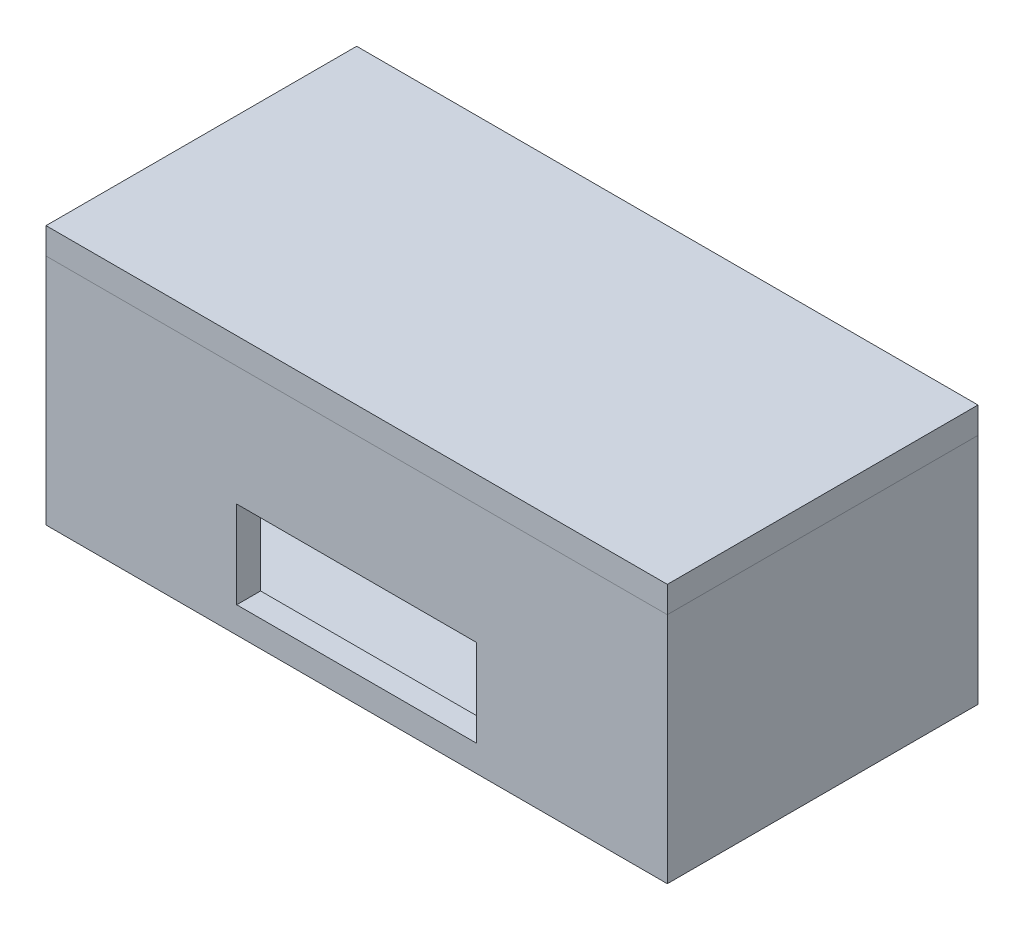
ISO-10303-21;
HEADER;
FILE_DESCRIPTION(('STEP AP214'),'2;1');
FILE_NAME('part.step','',(''),(''),'','','');
FILE_SCHEMA(('AUTOMOTIVE_DESIGN { 1 0 10303 214 1 1 1 1 }'));
ENDSEC;
DATA;
#1=APPLICATION_CONTEXT('core data for automotive mechanical design processes');
#2=APPLICATION_PROTOCOL_DEFINITION('international standard','automotive_design',2000,#1);
#3=PRODUCT_CONTEXT('',#1,'mechanical');
#4=PRODUCT('Part','Part','',(#3));
#5=PRODUCT_RELATED_PRODUCT_CATEGORY('part','',(#4));
#6=PRODUCT_DEFINITION_FORMATION('','',#4);
#7=PRODUCT_DEFINITION_CONTEXT('part definition',#1,'design');
#8=PRODUCT_DEFINITION('design','',#6,#7);
#9=PRODUCT_DEFINITION_SHAPE('','',#8);
#10=(LENGTH_UNIT() NAMED_UNIT(*) SI_UNIT(.MILLI.,.METRE.));
#11=(NAMED_UNIT(*) PLANE_ANGLE_UNIT() SI_UNIT($,.RADIAN.));
#12=(NAMED_UNIT(*) SI_UNIT($,.STERADIAN.) SOLID_ANGLE_UNIT());
#13=UNCERTAINTY_MEASURE_WITH_UNIT(LENGTH_MEASURE(1.E-05),#10,'distance_accuracy_value','');
#14=(GEOMETRIC_REPRESENTATION_CONTEXT(3) GLOBAL_UNCERTAINTY_ASSIGNED_CONTEXT((#13)) GLOBAL_UNIT_ASSIGNED_CONTEXT((#10,
#11,#12)) REPRESENTATION_CONTEXT('',''));
#15=CARTESIAN_POINT('',(0.,0.,0.));
#16=DIRECTION('',(0.,0.,1.));
#17=DIRECTION('',(1.,0.,0.));
#18=AXIS2_PLACEMENT_3D('',#15,#16,#17);
#19=CARTESIAN_POINT('',(0.,54.25,32.5));
#20=DIRECTION('',(0.,0.,-1.));
#21=DIRECTION('',(-1.,0.,0.));
#22=AXIS2_PLACEMENT_3D('',#19,#20,#21);
#23=PLANE('',#22);
#24=DIRECTION('',(1.,0.,0.));
#25=VECTOR('',#24,1.);
#26=CARTESIAN_POINT('',(0.,48.75,32.5));
#27=LINE('',#26,#25);
#28=CARTESIAN_POINT('',(-65.,48.75,32.5));
#29=VERTEX_POINT('',#28);
#30=CARTESIAN_POINT('',(65.,48.75,32.5));
#31=VERTEX_POINT('',#30);
#32=EDGE_CURVE('E158',#29,#31,#27,.T.);
#33=ORIENTED_EDGE('',*,*,#32,.T.);
#34=DIRECTION('',(0.,-1.,0.));
#35=VECTOR('',#34,1.);
#36=CARTESIAN_POINT('',(65.,54.25,32.5));
#37=LINE('',#36,#35);
#38=CARTESIAN_POINT('',(65.,54.25,32.5));
#39=VERTEX_POINT('',#38);
#40=EDGE_CURVE('E12',#39,#31,#37,.T.);
#41=ORIENTED_EDGE('',*,*,#40,.F.);
#42=DIRECTION('',(1.,0.,0.));
#43=VECTOR('',#42,1.);
#44=CARTESIAN_POINT('',(0.,54.25,32.5));
#45=LINE('',#44,#43);
#46=CARTESIAN_POINT('',(-65.,54.25,32.5));
#47=VERTEX_POINT('',#46);
#48=EDGE_CURVE('E162',#47,#39,#45,.T.);
#49=ORIENTED_EDGE('',*,*,#48,.F.);
#50=DIRECTION('',(0.,-1.,0.));
#51=VECTOR('',#50,1.);
#52=CARTESIAN_POINT('',(-65.,54.25,32.5));
#53=LINE('',#52,#51);
#54=EDGE_CURVE('E168',#47,#29,#53,.T.);
#55=ORIENTED_EDGE('',*,*,#54,.T.);
#56=EDGE_LOOP('',(#33,#41,#49,#55));
#57=FACE_BOUND('',#56,.T.);
#58=ADVANCED_FACE('F50',(#57),#23,.F.);
#59=CARTESIAN_POINT('',(65.,54.25,0.));
#60=DIRECTION('',(-1.,0.,0.));
#61=DIRECTION('',(0.,0.,1.));
#62=AXIS2_PLACEMENT_3D('',#59,#60,#61);
#63=PLANE('',#62);
#64=DIRECTION('',(0.,0.,-1.));
#65=VECTOR('',#64,1.);
#66=CARTESIAN_POINT('',(65.,48.75,0.));
#67=LINE('',#66,#65);
#68=CARTESIAN_POINT('',(65.,48.75,-32.5));
#69=VERTEX_POINT('',#68);
#70=EDGE_CURVE('E171',#31,#69,#67,.T.);
#71=ORIENTED_EDGE('',*,*,#70,.T.);
#72=DIRECTION('',(0.,-1.,0.));
#73=VECTOR('',#72,1.);
#74=CARTESIAN_POINT('',(65.,54.25,-32.5));
#75=LINE('',#74,#73);
#76=CARTESIAN_POINT('',(65.,54.25,-32.5));
#77=VERTEX_POINT('',#76);
#78=EDGE_CURVE('E57',#77,#69,#75,.T.);
#79=ORIENTED_EDGE('',*,*,#78,.F.);
#80=DIRECTION('',(0.,0.,-1.));
#81=VECTOR('',#80,1.);
#82=CARTESIAN_POINT('',(65.,54.25,0.));
#83=LINE('',#82,#81);
#84=EDGE_CURVE('E101',#39,#77,#83,.T.);
#85=ORIENTED_EDGE('',*,*,#84,.F.);
#86=ORIENTED_EDGE('',*,*,#40,.T.);
#87=EDGE_LOOP('',(#71,#79,#85,#86));
#88=FACE_BOUND('',#87,.T.);
#89=ADVANCED_FACE('F199',(#88),#63,.F.);
#90=CARTESIAN_POINT('',(0.,54.25,-32.5));
#91=DIRECTION('',(0.,0.,1.));
#92=DIRECTION('',(1.,0.,0.));
#93=AXIS2_PLACEMENT_3D('',#90,#91,#92);
#94=PLANE('',#93);
#95=DIRECTION('',(-1.,0.,0.));
#96=VECTOR('',#95,1.);
#97=CARTESIAN_POINT('',(0.,48.75,-32.5));
#98=LINE('',#97,#96);
#99=CARTESIAN_POINT('',(-65.,48.75,-32.5));
#100=VERTEX_POINT('',#99);
#101=EDGE_CURVE('E173',#69,#100,#98,.T.);
#102=ORIENTED_EDGE('',*,*,#101,.T.);
#103=DIRECTION('',(0.,-1.,0.));
#104=VECTOR('',#103,1.);
#105=CARTESIAN_POINT('',(-65.,54.25,-32.5));
#106=LINE('',#105,#104);
#107=CARTESIAN_POINT('',(-65.,54.25,-32.5));
#108=VERTEX_POINT('',#107);
#109=EDGE_CURVE('E177',#108,#100,#106,.T.);
#110=ORIENTED_EDGE('',*,*,#109,.F.);
#111=DIRECTION('',(-1.,0.,0.));
#112=VECTOR('',#111,1.);
#113=CARTESIAN_POINT('',(0.,54.25,-32.5));
#114=LINE('',#113,#112);
#115=EDGE_CURVE('E165',#77,#108,#114,.T.);
#116=ORIENTED_EDGE('',*,*,#115,.F.);
#117=ORIENTED_EDGE('',*,*,#78,.T.);
#118=EDGE_LOOP('',(#102,#110,#116,#117));
#119=FACE_BOUND('',#118,.T.);
#120=ADVANCED_FACE('F182',(#119),#94,.F.);
#121=CARTESIAN_POINT('',(-65.,54.25,0.));
#122=DIRECTION('',(1.,0.,0.));
#123=DIRECTION('',(0.,0.,-1.));
#124=AXIS2_PLACEMENT_3D('',#121,#122,#123);
#125=PLANE('',#124);
#126=DIRECTION('',(0.,0.,1.));
#127=VECTOR('',#126,1.);
#128=CARTESIAN_POINT('',(-65.,48.75,0.));
#129=LINE('',#128,#127);
#130=EDGE_CURVE('E94',#100,#29,#129,.T.);
#131=ORIENTED_EDGE('',*,*,#130,.T.);
#132=ORIENTED_EDGE('',*,*,#54,.F.);
#133=DIRECTION('',(0.,0.,1.));
#134=VECTOR('',#133,1.);
#135=CARTESIAN_POINT('',(-65.,54.25,0.));
#136=LINE('',#135,#134);
#137=EDGE_CURVE('E73',#108,#47,#136,.T.);
#138=ORIENTED_EDGE('',*,*,#137,.F.);
#139=ORIENTED_EDGE('',*,*,#109,.T.);
#140=EDGE_LOOP('',(#131,#132,#138,#139));
#141=FACE_BOUND('',#140,.T.);
#142=ADVANCED_FACE('F190',(#141),#125,.F.);
#143=CARTESIAN_POINT('',(0.,54.25,0.));
#144=DIRECTION('',(0.,1.,0.));
#145=DIRECTION('',(0.,0.,1.));
#146=AXIS2_PLACEMENT_3D('',#143,#144,#145);
#147=PLANE('',#146);
#148=ORIENTED_EDGE('',*,*,#48,.T.);
#149=ORIENTED_EDGE('',*,*,#84,.T.);
#150=ORIENTED_EDGE('',*,*,#115,.T.);
#151=ORIENTED_EDGE('',*,*,#137,.T.);
#152=EDGE_LOOP('',(#148,#149,#150,#151));
#153=FACE_BOUND('',#152,.T.);
#154=ADVANCED_FACE('F192',(#153),#147,.T.);
#155=CARTESIAN_POINT('',(0.,48.75,0.));
#156=DIRECTION('',(0.,1.,0.));
#157=DIRECTION('',(0.,0.,1.));
#158=AXIS2_PLACEMENT_3D('',#155,#156,#157);
#159=PLANE('',#158);
#160=DIRECTION('',(1.,0.,0.));
#161=VECTOR('',#160,1.);
#162=CARTESIAN_POINT('',(0.,48.75,27.));
#163=LINE('',#162,#161);
#164=CARTESIAN_POINT('',(-59.5,48.75,27.));
#165=VERTEX_POINT('',#164);
#166=CARTESIAN_POINT('',(59.5,48.75,27.));
#167=VERTEX_POINT('',#166);
#168=EDGE_CURVE('E145',#165,#167,#163,.T.);
#169=ORIENTED_EDGE('',*,*,#168,.T.);
#170=DIRECTION('',(0.,0.,-1.));
#171=VECTOR('',#170,1.);
#172=CARTESIAN_POINT('',(59.5,48.75,0.));
#173=LINE('',#172,#171);
#174=CARTESIAN_POINT('',(59.5,48.75,-27.));
#175=VERTEX_POINT('',#174);
#176=EDGE_CURVE('E64',#167,#175,#173,.T.);
#177=ORIENTED_EDGE('',*,*,#176,.T.);
#178=DIRECTION('',(-1.,0.,0.));
#179=VECTOR('',#178,1.);
#180=CARTESIAN_POINT('',(0.,48.75,-27.));
#181=LINE('',#180,#179);
#182=CARTESIAN_POINT('',(-59.5,48.75,-27.));
#183=VERTEX_POINT('',#182);
#184=EDGE_CURVE('E128',#175,#183,#181,.T.);
#185=ORIENTED_EDGE('',*,*,#184,.T.);
#186=DIRECTION('',(0.,0.,1.));
#187=VECTOR('',#186,1.);
#188=CARTESIAN_POINT('',(-59.5,48.75,0.));
#189=LINE('',#188,#187);
#190=EDGE_CURVE('E148',#183,#165,#189,.T.);
#191=ORIENTED_EDGE('',*,*,#190,.T.);
#192=EDGE_LOOP('',(#169,#177,#185,#191));
#193=FACE_BOUND('',#192,.T.);
#194=ORIENTED_EDGE('',*,*,#32,.F.);
#195=ORIENTED_EDGE('',*,*,#130,.F.);
#196=ORIENTED_EDGE('',*,*,#101,.F.);
#197=ORIENTED_EDGE('',*,*,#70,.F.);
#198=EDGE_LOOP('',(#194,#195,#196,#197));
#199=FACE_BOUND('',#198,.T.);
#200=ADVANCED_FACE('F186',(#193,#199),#159,.F.);
#201=CARTESIAN_POINT('',(59.5,43.25,0.));
#202=DIRECTION('',(1.,0.,0.));
#203=DIRECTION('',(0.,0.,-1.));
#204=AXIS2_PLACEMENT_3D('',#201,#202,#203);
#205=PLANE('',#204);
#206=ORIENTED_EDGE('',*,*,#176,.F.);
#207=DIRECTION('',(0.,1.,0.));
#208=VECTOR('',#207,1.);
#209=CARTESIAN_POINT('',(59.5,43.25,27.));
#210=LINE('',#209,#208);
#211=CARTESIAN_POINT('',(59.5,43.25,27.));
#212=VERTEX_POINT('',#211);
#213=EDGE_CURVE('E144',#212,#167,#210,.T.);
#214=ORIENTED_EDGE('',*,*,#213,.F.);
#215=DIRECTION('',(0.,0.,-1.));
#216=VECTOR('',#215,1.);
#217=CARTESIAN_POINT('',(59.5,43.25,0.));
#218=LINE('',#217,#216);
#219=CARTESIAN_POINT('',(59.5,43.25,-27.));
#220=VERTEX_POINT('',#219);
#221=EDGE_CURVE('E138',#212,#220,#218,.T.);
#222=ORIENTED_EDGE('',*,*,#221,.T.);
#223=DIRECTION('',(0.,1.,0.));
#224=VECTOR('',#223,1.);
#225=CARTESIAN_POINT('',(59.5,43.25,-27.));
#226=LINE('',#225,#224);
#227=EDGE_CURVE('E123',#220,#175,#226,.T.);
#228=ORIENTED_EDGE('',*,*,#227,.T.);
#229=EDGE_LOOP('',(#206,#214,#222,#228));
#230=FACE_BOUND('',#229,.T.);
#231=ADVANCED_FACE('F143',(#230),#205,.T.);
#232=CARTESIAN_POINT('',(0.,43.25,27.));
#233=DIRECTION('',(0.,0.,1.));
#234=DIRECTION('',(1.,0.,0.));
#235=AXIS2_PLACEMENT_3D('',#232,#233,#234);
#236=PLANE('',#235);
#237=ORIENTED_EDGE('',*,*,#168,.F.);
#238=DIRECTION('',(0.,1.,0.));
#239=VECTOR('',#238,1.);
#240=CARTESIAN_POINT('',(-59.5,43.25,27.));
#241=LINE('',#240,#239);
#242=CARTESIAN_POINT('',(-59.5,43.25,27.));
#243=VERTEX_POINT('',#242);
#244=EDGE_CURVE('E159',#243,#165,#241,.T.);
#245=ORIENTED_EDGE('',*,*,#244,.F.);
#246=DIRECTION('',(1.,0.,0.));
#247=VECTOR('',#246,1.);
#248=CARTESIAN_POINT('',(0.,43.25,27.));
#249=LINE('',#248,#247);
#250=EDGE_CURVE('E131',#243,#212,#249,.T.);
#251=ORIENTED_EDGE('',*,*,#250,.T.);
#252=ORIENTED_EDGE('',*,*,#213,.T.);
#253=EDGE_LOOP('',(#237,#245,#251,#252));
#254=FACE_BOUND('',#253,.T.);
#255=ADVANCED_FACE('F241',(#254),#236,.T.);
#256=CARTESIAN_POINT('',(-59.5,43.25,0.));
#257=DIRECTION('',(-1.,0.,0.));
#258=DIRECTION('',(0.,0.,1.));
#259=AXIS2_PLACEMENT_3D('',#256,#257,#258);
#260=PLANE('',#259);
#261=ORIENTED_EDGE('',*,*,#190,.F.);
#262=DIRECTION('',(0.,1.,0.));
#263=VECTOR('',#262,1.);
#264=CARTESIAN_POINT('',(-59.5,43.25,-27.));
#265=LINE('',#264,#263);
#266=CARTESIAN_POINT('',(-59.5,43.25,-27.));
#267=VERTEX_POINT('',#266);
#268=EDGE_CURVE('E130',#267,#183,#265,.T.);
#269=ORIENTED_EDGE('',*,*,#268,.F.);
#270=DIRECTION('',(0.,0.,1.));
#271=VECTOR('',#270,1.);
#272=CARTESIAN_POINT('',(-59.5,43.25,0.));
#273=LINE('',#272,#271);
#274=EDGE_CURVE('E141',#267,#243,#273,.T.);
#275=ORIENTED_EDGE('',*,*,#274,.T.);
#276=ORIENTED_EDGE('',*,*,#244,.T.);
#277=EDGE_LOOP('',(#261,#269,#275,#276));
#278=FACE_BOUND('',#277,.T.);
#279=ADVANCED_FACE('F250',(#278),#260,.T.);
#280=CARTESIAN_POINT('',(0.,43.25,-27.));
#281=DIRECTION('',(0.,0.,-1.));
#282=DIRECTION('',(-1.,0.,0.));
#283=AXIS2_PLACEMENT_3D('',#280,#281,#282);
#284=PLANE('',#283);
#285=ORIENTED_EDGE('',*,*,#184,.F.);
#286=ORIENTED_EDGE('',*,*,#227,.F.);
#287=DIRECTION('',(-1.,0.,0.));
#288=VECTOR('',#287,1.);
#289=CARTESIAN_POINT('',(0.,43.25,-27.));
#290=LINE('',#289,#288);
#291=EDGE_CURVE('E126',#220,#267,#290,.T.);
#292=ORIENTED_EDGE('',*,*,#291,.T.);
#293=ORIENTED_EDGE('',*,*,#268,.T.);
#294=EDGE_LOOP('',(#285,#286,#292,#293));
#295=FACE_BOUND('',#294,.T.);
#296=ADVANCED_FACE('F125',(#295),#284,.T.);
#297=CARTESIAN_POINT('',(0.,43.25,0.));
#298=DIRECTION('',(0.,1.,0.));
#299=DIRECTION('',(0.,0.,1.));
#300=AXIS2_PLACEMENT_3D('',#297,#298,#299);
#301=PLANE('',#300);
#302=ORIENTED_EDGE('',*,*,#221,.F.);
#303=ORIENTED_EDGE('',*,*,#250,.F.);
#304=ORIENTED_EDGE('',*,*,#274,.F.);
#305=ORIENTED_EDGE('',*,*,#291,.F.);
#306=EDGE_LOOP('',(#302,#303,#304,#305));
#307=FACE_BOUND('',#306,.T.);
#308=ADVANCED_FACE('F136',(#307),#301,.F.);
#309=CLOSED_SHELL('',(#58,#89,#120,#142,#154,#200,#231,#255,#279,#296,#308));
#310=MANIFOLD_SOLID_BREP('B2',#309);
#311=CARTESIAN_POINT('',(0.,48.75,0.));
#312=DIRECTION('',(0.,-1.,0.));
#313=DIRECTION('',(0.,0.,-1.));
#314=AXIS2_PLACEMENT_3D('',#311,#312,#313);
#315=PLANE('',#314);
#316=DIRECTION('',(0.,0.,-1.));
#317=VECTOR('',#316,1.);
#318=CARTESIAN_POINT('',(65.,48.75,32.5));
#319=LINE('',#318,#317);
#320=CARTESIAN_POINT('',(65.,48.75,32.5));
#321=VERTEX_POINT('',#320);
#322=CARTESIAN_POINT('',(65.,48.75,-32.5));
#323=VERTEX_POINT('',#322);
#324=EDGE_CURVE('E456',#321,#323,#319,.T.);
#325=ORIENTED_EDGE('',*,*,#324,.T.);
#326=DIRECTION('',(-1.,0.,0.));
#327=VECTOR('',#326,1.);
#328=CARTESIAN_POINT('',(-65.,48.75,-32.5));
#329=LINE('',#328,#327);
#330=CARTESIAN_POINT('',(-65.,48.75,-32.5));
#331=VERTEX_POINT('',#330);
#332=EDGE_CURVE('E459',#323,#331,#329,.T.);
#333=ORIENTED_EDGE('',*,*,#332,.T.);
#334=DIRECTION('',(0.,0.,1.));
#335=VECTOR('',#334,1.);
#336=CARTESIAN_POINT('',(-65.,48.75,32.5));
#337=LINE('',#336,#335);
#338=CARTESIAN_POINT('',(-65.,48.75,32.5));
#339=VERTEX_POINT('',#338);
#340=EDGE_CURVE('E462',#331,#339,#337,.T.);
#341=ORIENTED_EDGE('',*,*,#340,.T.);
#342=DIRECTION('',(1.,0.,0.));
#343=VECTOR('',#342,1.);
#344=CARTESIAN_POINT('',(-65.,48.75,32.5));
#345=LINE('',#344,#343);
#346=EDGE_CURVE('E464',#339,#321,#345,.T.);
#347=ORIENTED_EDGE('',*,*,#346,.T.);
#348=EDGE_LOOP('',(#325,#333,#341,#347));
#349=FACE_BOUND('',#348,.T.);
#350=DIRECTION('',(0.,0.,-1.));
#351=VECTOR('',#350,1.);
#352=CARTESIAN_POINT('',(60.,48.75,0.));
#353=LINE('',#352,#351);
#354=CARTESIAN_POINT('',(60.,48.75,27.5));
#355=VERTEX_POINT('',#354);
#356=CARTESIAN_POINT('',(60.,48.75,-27.5));
#357=VERTEX_POINT('',#356);
#358=EDGE_CURVE('E448',#355,#357,#353,.T.);
#359=ORIENTED_EDGE('',*,*,#358,.F.);
#360=DIRECTION('',(1.,0.,0.));
#361=VECTOR('',#360,1.);
#362=CARTESIAN_POINT('',(0.,48.75,27.5));
#363=LINE('',#362,#361);
#364=CARTESIAN_POINT('',(-60.,48.75,27.5));
#365=VERTEX_POINT('',#364);
#366=EDGE_CURVE('E438',#365,#355,#363,.T.);
#367=ORIENTED_EDGE('',*,*,#366,.F.);
#368=DIRECTION('',(0.,0.,1.));
#369=VECTOR('',#368,1.);
#370=CARTESIAN_POINT('',(-60.,48.75,0.));
#371=LINE('',#370,#369);
#372=CARTESIAN_POINT('',(-60.,48.75,-27.5));
#373=VERTEX_POINT('',#372);
#374=EDGE_CURVE('E452',#373,#365,#371,.T.);
#375=ORIENTED_EDGE('',*,*,#374,.F.);
#376=DIRECTION('',(-1.,0.,0.));
#377=VECTOR('',#376,1.);
#378=CARTESIAN_POINT('',(0.,48.75,-27.5));
#379=LINE('',#378,#377);
#380=EDGE_CURVE('E450',#357,#373,#379,.T.);
#381=ORIENTED_EDGE('',*,*,#380,.F.);
#382=EDGE_LOOP('',(#359,#367,#375,#381));
#383=FACE_BOUND('',#382,.T.);
#384=ADVANCED_FACE('F300',(#349,#383),#315,.F.);
#385=CARTESIAN_POINT('',(65.,48.75,32.5));
#386=DIRECTION('',(-1.,0.,0.));
#387=DIRECTION('',(0.,0.,1.));
#388=AXIS2_PLACEMENT_3D('',#385,#386,#387);
#389=PLANE('',#388);
#390=DIRECTION('',(0.,0.,-1.));
#391=VECTOR('',#390,1.);
#392=CARTESIAN_POINT('',(65.,0.,32.5));
#393=LINE('',#392,#391);
#394=CARTESIAN_POINT('',(65.,0.,32.5));
#395=VERTEX_POINT('',#394);
#396=CARTESIAN_POINT('',(65.,0.,-32.5));
#397=VERTEX_POINT('',#396);
#398=EDGE_CURVE('E432',#395,#397,#393,.T.);
#399=ORIENTED_EDGE('',*,*,#398,.T.);
#400=DIRECTION('',(0.,-1.,0.));
#401=VECTOR('',#400,1.);
#402=CARTESIAN_POINT('',(65.,48.75,-32.5));
#403=LINE('',#402,#401);
#404=EDGE_CURVE('E48',#323,#397,#403,.T.);
#405=ORIENTED_EDGE('',*,*,#404,.F.);
#406=ORIENTED_EDGE('',*,*,#324,.F.);
#407=DIRECTION('',(0.,-1.,0.));
#408=VECTOR('',#407,1.);
#409=CARTESIAN_POINT('',(65.,48.75,32.5));
#410=LINE('',#409,#408);
#411=EDGE_CURVE('E466',#321,#395,#410,.T.);
#412=ORIENTED_EDGE('',*,*,#411,.T.);
#413=EDGE_LOOP('',(#399,#405,#406,#412));
#414=FACE_BOUND('',#413,.T.);
#415=ADVANCED_FACE('F302',(#414),#389,.F.);
#416=CARTESIAN_POINT('',(-65.,48.75,-32.5));
#417=DIRECTION('',(0.,0.,1.));
#418=DIRECTION('',(1.,0.,0.));
#419=AXIS2_PLACEMENT_3D('',#416,#417,#418);
#420=PLANE('',#419);
#421=DIRECTION('',(-1.,0.,0.));
#422=VECTOR('',#421,1.);
#423=CARTESIAN_POINT('',(-65.,0.,-32.5));
#424=LINE('',#423,#422);
#425=CARTESIAN_POINT('',(-65.,0.,-32.5));
#426=VERTEX_POINT('',#425);
#427=EDGE_CURVE('E469',#397,#426,#424,.T.);
#428=ORIENTED_EDGE('',*,*,#427,.T.);
#429=DIRECTION('',(0.,-1.,0.));
#430=VECTOR('',#429,1.);
#431=CARTESIAN_POINT('',(-65.,48.75,-32.5));
#432=LINE('',#431,#430);
#433=EDGE_CURVE('E308',#331,#426,#432,.T.);
#434=ORIENTED_EDGE('',*,*,#433,.F.);
#435=ORIENTED_EDGE('',*,*,#332,.F.);
#436=ORIENTED_EDGE('',*,*,#404,.T.);
#437=EDGE_LOOP('',(#428,#434,#435,#436));
#438=FACE_BOUND('',#437,.T.);
#439=ADVANCED_FACE('F499',(#438),#420,.F.);
#440=CARTESIAN_POINT('',(-65.,48.75,32.5));
#441=DIRECTION('',(1.,0.,0.));
#442=DIRECTION('',(0.,0.,-1.));
#443=AXIS2_PLACEMENT_3D('',#440,#441,#442);
#444=PLANE('',#443);
#445=DIRECTION('',(0.,0.,1.));
#446=VECTOR('',#445,1.);
#447=CARTESIAN_POINT('',(-65.,0.,32.5));
#448=LINE('',#447,#446);
#449=CARTESIAN_POINT('',(-65.,0.,32.5));
#450=VERTEX_POINT('',#449);
#451=EDGE_CURVE('E471',#426,#450,#448,.T.);
#452=ORIENTED_EDGE('',*,*,#451,.T.);
#453=DIRECTION('',(0.,-1.,0.));
#454=VECTOR('',#453,1.);
#455=CARTESIAN_POINT('',(-65.,48.75,32.5));
#456=LINE('',#455,#454);
#457=EDGE_CURVE('E476',#339,#450,#456,.T.);
#458=ORIENTED_EDGE('',*,*,#457,.F.);
#459=ORIENTED_EDGE('',*,*,#340,.F.);
#460=ORIENTED_EDGE('',*,*,#433,.T.);
#461=EDGE_LOOP('',(#452,#458,#459,#460));
#462=FACE_BOUND('',#461,.T.);
#463=ADVANCED_FACE('F483',(#462),#444,.F.);
#464=CARTESIAN_POINT('',(-65.,48.75,32.5));
#465=DIRECTION('',(0.,0.,-1.));
#466=DIRECTION('',(-1.,0.,0.));
#467=AXIS2_PLACEMENT_3D('',#464,#465,#466);
#468=PLANE('',#467);
#469=DIRECTION('',(0.,-1.,0.));
#470=VECTOR('',#469,1.);
#471=CARTESIAN_POINT('',(-25.1,5.5,32.5));
#472=LINE('',#471,#470);
#473=CARTESIAN_POINT('',(-25.1,23.76,32.5));
#474=VERTEX_POINT('',#473);
#475=CARTESIAN_POINT('',(-25.1,5.5,32.5));
#476=VERTEX_POINT('',#475);
#477=EDGE_CURVE('E404',#474,#476,#472,.T.);
#478=ORIENTED_EDGE('',*,*,#477,.F.);
#479=DIRECTION('',(-1.,0.,0.));
#480=VECTOR('',#479,1.);
#481=CARTESIAN_POINT('',(-25.1,23.76,32.5));
#482=LINE('',#481,#480);
#483=CARTESIAN_POINT('',(25.1,23.76,32.5));
#484=VERTEX_POINT('',#483);
#485=EDGE_CURVE('E416',#484,#474,#482,.T.);
#486=ORIENTED_EDGE('',*,*,#485,.F.);
#487=DIRECTION('',(0.,1.,0.));
#488=VECTOR('',#487,1.);
#489=CARTESIAN_POINT('',(25.1,5.5,32.5));
#490=LINE('',#489,#488);
#491=CARTESIAN_POINT('',(25.1,5.50000000000001,32.5));
#492=VERTEX_POINT('',#491);
#493=EDGE_CURVE('E414',#492,#484,#490,.T.);
#494=ORIENTED_EDGE('',*,*,#493,.F.);
#495=DIRECTION('',(1.,0.,0.));
#496=VECTOR('',#495,1.);
#497=CARTESIAN_POINT('',(-25.1,5.5,32.5));
#498=LINE('',#497,#496);
#499=EDGE_CURVE('E315',#476,#492,#498,.T.);
#500=ORIENTED_EDGE('',*,*,#499,.F.);
#501=EDGE_LOOP('',(#478,#486,#494,#500));
#502=FACE_BOUND('',#501,.T.);
#503=DIRECTION('',(1.,0.,0.));
#504=VECTOR('',#503,1.);
#505=CARTESIAN_POINT('',(-65.,0.,32.5));
#506=LINE('',#505,#504);
#507=EDGE_CURVE('E460',#450,#395,#506,.T.);
#508=ORIENTED_EDGE('',*,*,#507,.T.);
#509=ORIENTED_EDGE('',*,*,#411,.F.);
#510=ORIENTED_EDGE('',*,*,#346,.F.);
#511=ORIENTED_EDGE('',*,*,#457,.T.);
#512=EDGE_LOOP('',(#508,#509,#510,#511));
#513=FACE_BOUND('',#512,.T.);
#514=ADVANCED_FACE('F492',(#502,#513),#468,.F.);
#515=CARTESIAN_POINT('',(0.,0.,0.));
#516=DIRECTION('',(0.,-1.,0.));
#517=DIRECTION('',(0.,0.,-1.));
#518=AXIS2_PLACEMENT_3D('',#515,#516,#517);
#519=PLANE('',#518);
#520=ORIENTED_EDGE('',*,*,#398,.F.);
#521=ORIENTED_EDGE('',*,*,#507,.F.);
#522=ORIENTED_EDGE('',*,*,#451,.F.);
#523=ORIENTED_EDGE('',*,*,#427,.F.);
#524=EDGE_LOOP('',(#520,#521,#522,#523));
#525=FACE_BOUND('',#524,.T.);
#526=ADVANCED_FACE('F489',(#525),#519,.T.);
#527=CARTESIAN_POINT('',(60.,48.75,32.5));
#528=DIRECTION('',(-1.,0.,0.));
#529=DIRECTION('',(0.,0.,1.));
#530=AXIS2_PLACEMENT_3D('',#527,#528,#529);
#531=PLANE('',#530);
#532=DIRECTION('',(0.,0.,-1.));
#533=VECTOR('',#532,1.);
#534=CARTESIAN_POINT('',(60.,5.,0.));
#535=LINE('',#534,#533);
#536=CARTESIAN_POINT('',(60.,5.,27.5));
#537=VERTEX_POINT('',#536);
#538=CARTESIAN_POINT('',(60.,5.,-27.5));
#539=VERTEX_POINT('',#538);
#540=EDGE_CURVE('E425',#537,#539,#535,.T.);
#541=ORIENTED_EDGE('',*,*,#540,.F.);
#542=DIRECTION('',(0.,-1.,0.));
#543=VECTOR('',#542,1.);
#544=CARTESIAN_POINT('',(60.,48.75,27.5));
#545=LINE('',#544,#543);
#546=EDGE_CURVE('E434',#355,#537,#545,.T.);
#547=ORIENTED_EDGE('',*,*,#546,.F.);
#548=ORIENTED_EDGE('',*,*,#358,.T.);
#549=DIRECTION('',(0.,-1.,0.));
#550=VECTOR('',#549,1.);
#551=CARTESIAN_POINT('',(60.,48.75,-27.5));
#552=LINE('',#551,#550);
#553=EDGE_CURVE('E429',#357,#539,#552,.T.);
#554=ORIENTED_EDGE('',*,*,#553,.T.);
#555=EDGE_LOOP('',(#541,#547,#548,#554));
#556=FACE_BOUND('',#555,.T.);
#557=ADVANCED_FACE('F516',(#556),#531,.T.);
#558=CARTESIAN_POINT('',(-65.,48.75,-27.5));
#559=DIRECTION('',(0.,0.,1.));
#560=DIRECTION('',(1.,0.,0.));
#561=AXIS2_PLACEMENT_3D('',#558,#559,#560);
#562=PLANE('',#561);
#563=DIRECTION('',(-1.,0.,0.));
#564=VECTOR('',#563,1.);
#565=CARTESIAN_POINT('',(0.,5.,-27.5));
#566=LINE('',#565,#564);
#567=CARTESIAN_POINT('',(-60.,5.,-27.5));
#568=VERTEX_POINT('',#567);
#569=EDGE_CURVE('E428',#539,#568,#566,.T.);
#570=ORIENTED_EDGE('',*,*,#569,.F.);
#571=ORIENTED_EDGE('',*,*,#553,.F.);
#572=ORIENTED_EDGE('',*,*,#380,.T.);
#573=DIRECTION('',(0.,-1.,0.));
#574=VECTOR('',#573,1.);
#575=CARTESIAN_POINT('',(-60.,48.75,-27.5));
#576=LINE('',#575,#574);
#577=EDGE_CURVE('E433',#373,#568,#576,.T.);
#578=ORIENTED_EDGE('',*,*,#577,.T.);
#579=EDGE_LOOP('',(#570,#571,#572,#578));
#580=FACE_BOUND('',#579,.T.);
#581=ADVANCED_FACE('F536',(#580),#562,.T.);
#582=CARTESIAN_POINT('',(-60.,48.75,32.5));
#583=DIRECTION('',(1.,0.,0.));
#584=DIRECTION('',(0.,0.,-1.));
#585=AXIS2_PLACEMENT_3D('',#582,#583,#584);
#586=PLANE('',#585);
#587=DIRECTION('',(0.,0.,1.));
#588=VECTOR('',#587,1.);
#589=CARTESIAN_POINT('',(-60.,5.,0.));
#590=LINE('',#589,#588);
#591=CARTESIAN_POINT('',(-60.,5.,27.5));
#592=VERTEX_POINT('',#591);
#593=EDGE_CURVE('E440',#568,#592,#590,.T.);
#594=ORIENTED_EDGE('',*,*,#593,.F.);
#595=ORIENTED_EDGE('',*,*,#577,.F.);
#596=ORIENTED_EDGE('',*,*,#374,.T.);
#597=DIRECTION('',(0.,-1.,0.));
#598=VECTOR('',#597,1.);
#599=CARTESIAN_POINT('',(-60.,48.75,27.5));
#600=LINE('',#599,#598);
#601=EDGE_CURVE('E437',#365,#592,#600,.T.);
#602=ORIENTED_EDGE('',*,*,#601,.T.);
#603=EDGE_LOOP('',(#594,#595,#596,#602));
#604=FACE_BOUND('',#603,.T.);
#605=ADVANCED_FACE('F540',(#604),#586,.T.);
#606=CARTESIAN_POINT('',(-65.,48.75,27.5));
#607=DIRECTION('',(0.,0.,-1.));
#608=DIRECTION('',(-1.,0.,0.));
#609=AXIS2_PLACEMENT_3D('',#606,#607,#608);
#610=PLANE('',#609);
#611=DIRECTION('',(-1.,0.,0.));
#612=VECTOR('',#611,1.);
#613=CARTESIAN_POINT('',(-25.1,23.76,27.5));
#614=LINE('',#613,#612);
#615=CARTESIAN_POINT('',(25.1,23.76,27.5));
#616=VERTEX_POINT('',#615);
#617=CARTESIAN_POINT('',(-25.1,23.76,27.5));
#618=VERTEX_POINT('',#617);
#619=EDGE_CURVE('E410',#616,#618,#614,.T.);
#620=ORIENTED_EDGE('',*,*,#619,.T.);
#621=DIRECTION('',(0.,-1.,0.));
#622=VECTOR('',#621,1.);
#623=CARTESIAN_POINT('',(-25.1,5.5,27.5));
#624=LINE('',#623,#622);
#625=CARTESIAN_POINT('',(-25.1,5.5,27.5));
#626=VERTEX_POINT('',#625);
#627=EDGE_CURVE('E398',#618,#626,#624,.T.);
#628=ORIENTED_EDGE('',*,*,#627,.T.);
#629=DIRECTION('',(1.,0.,0.));
#630=VECTOR('',#629,1.);
#631=CARTESIAN_POINT('',(-25.1,5.5,27.5));
#632=LINE('',#631,#630);
#633=CARTESIAN_POINT('',(25.1,5.5,27.5));
#634=VERTEX_POINT('',#633);
#635=EDGE_CURVE('E388',#626,#634,#632,.T.);
#636=ORIENTED_EDGE('',*,*,#635,.T.);
#637=DIRECTION('',(0.,1.,0.));
#638=VECTOR('',#637,1.);
#639=CARTESIAN_POINT('',(25.1,5.5,27.5));
#640=LINE('',#639,#638);
#641=EDGE_CURVE('E397',#634,#616,#640,.T.);
#642=ORIENTED_EDGE('',*,*,#641,.T.);
#643=EDGE_LOOP('',(#620,#628,#636,#642));
#644=FACE_BOUND('',#643,.T.);
#645=DIRECTION('',(1.,0.,0.));
#646=VECTOR('',#645,1.);
#647=CARTESIAN_POINT('',(0.,5.,27.5));
#648=LINE('',#647,#646);
#649=EDGE_CURVE('E444',#592,#537,#648,.T.);
#650=ORIENTED_EDGE('',*,*,#649,.F.);
#651=ORIENTED_EDGE('',*,*,#601,.F.);
#652=ORIENTED_EDGE('',*,*,#366,.T.);
#653=ORIENTED_EDGE('',*,*,#546,.T.);
#654=EDGE_LOOP('',(#650,#651,#652,#653));
#655=FACE_BOUND('',#654,.T.);
#656=ADVANCED_FACE('F408',(#644,#655),#610,.T.);
#657=CARTESIAN_POINT('',(0.,5.,0.));
#658=DIRECTION('',(0.,-1.,0.));
#659=DIRECTION('',(0.,0.,-1.));
#660=AXIS2_PLACEMENT_3D('',#657,#658,#659);
#661=PLANE('',#660);
#662=ORIENTED_EDGE('',*,*,#540,.T.);
#663=ORIENTED_EDGE('',*,*,#569,.T.);
#664=ORIENTED_EDGE('',*,*,#593,.T.);
#665=ORIENTED_EDGE('',*,*,#649,.T.);
#666=EDGE_LOOP('',(#662,#663,#664,#665));
#667=FACE_BOUND('',#666,.T.);
#668=ADVANCED_FACE('F512',(#667),#661,.F.);
#669=CARTESIAN_POINT('',(-25.1,23.76,-32.501));
#670=DIRECTION('',(0.,1.,0.));
#671=DIRECTION('',(0.,0.,1.));
#672=AXIS2_PLACEMENT_3D('',#669,#670,#671);
#673=PLANE('',#672);
#674=DIRECTION('',(0.,0.,1.));
#675=VECTOR('',#674,1.);
#676=CARTESIAN_POINT('',(25.1,23.76,-32.501));
#677=LINE('',#676,#675);
#678=EDGE_CURVE('E323',#616,#484,#677,.T.);
#679=ORIENTED_EDGE('',*,*,#678,.T.);
#680=ORIENTED_EDGE('',*,*,#485,.T.);
#681=DIRECTION('',(0.,0.,1.));
#682=VECTOR('',#681,1.);
#683=CARTESIAN_POINT('',(-25.1,23.76,-32.501));
#684=LINE('',#683,#682);
#685=EDGE_CURVE('E405',#618,#474,#684,.T.);
#686=ORIENTED_EDGE('',*,*,#685,.F.);
#687=ORIENTED_EDGE('',*,*,#619,.F.);
#688=EDGE_LOOP('',(#679,#680,#686,#687));
#689=FACE_BOUND('',#688,.T.);
#690=ADVANCED_FACE('F532',(#689),#673,.F.);
#691=CARTESIAN_POINT('',(-25.1,5.5,-32.501));
#692=DIRECTION('',(-1.,0.,0.));
#693=DIRECTION('',(0.,-1.,0.));
#694=AXIS2_PLACEMENT_3D('',#691,#692,#693);
#695=PLANE('',#694);
#696=ORIENTED_EDGE('',*,*,#685,.T.);
#697=ORIENTED_EDGE('',*,*,#477,.T.);
#698=DIRECTION('',(0.,0.,1.));
#699=VECTOR('',#698,1.);
#700=CARTESIAN_POINT('',(-25.1,5.5,-32.501));
#701=LINE('',#700,#699);
#702=EDGE_CURVE('E391',#626,#476,#701,.T.);
#703=ORIENTED_EDGE('',*,*,#702,.F.);
#704=ORIENTED_EDGE('',*,*,#627,.F.);
#705=EDGE_LOOP('',(#696,#697,#703,#704));
#706=FACE_BOUND('',#705,.T.);
#707=ADVANCED_FACE('F401',(#706),#695,.F.);
#708=CARTESIAN_POINT('',(-25.1,5.5,-32.501));
#709=DIRECTION('',(0.,-1.,0.));
#710=DIRECTION('',(0.,0.,-1.));
#711=AXIS2_PLACEMENT_3D('',#708,#709,#710);
#712=PLANE('',#711);
#713=ORIENTED_EDGE('',*,*,#702,.T.);
#714=ORIENTED_EDGE('',*,*,#499,.T.);
#715=DIRECTION('',(0.,0.,1.));
#716=VECTOR('',#715,1.);
#717=CARTESIAN_POINT('',(25.1,5.5,-32.501));
#718=LINE('',#717,#716);
#719=EDGE_CURVE('E393',#634,#492,#718,.T.);
#720=ORIENTED_EDGE('',*,*,#719,.F.);
#721=ORIENTED_EDGE('',*,*,#635,.F.);
#722=EDGE_LOOP('',(#713,#714,#720,#721));
#723=FACE_BOUND('',#722,.T.);
#724=ADVANCED_FACE('F390',(#723),#712,.F.);
#725=CARTESIAN_POINT('',(25.1,5.5,-32.501));
#726=DIRECTION('',(1.,0.,0.));
#727=DIRECTION('',(0.,1.,0.));
#728=AXIS2_PLACEMENT_3D('',#725,#726,#727);
#729=PLANE('',#728);
#730=ORIENTED_EDGE('',*,*,#719,.T.);
#731=ORIENTED_EDGE('',*,*,#493,.T.);
#732=ORIENTED_EDGE('',*,*,#678,.F.);
#733=ORIENTED_EDGE('',*,*,#641,.F.);
#734=EDGE_LOOP('',(#730,#731,#732,#733));
#735=FACE_BOUND('',#734,.T.);
#736=ADVANCED_FACE('F523',(#735),#729,.F.);
#737=CLOSED_SHELL('',(#384,#415,#439,#463,#514,#526,#557,#581,#605,#656,#668,#690,#707,#724,#736));
#738=MANIFOLD_SOLID_BREP('B6',#737);
#739=ADVANCED_BREP_SHAPE_REPRESENTATION('',(#18,#310,#738),#14);
#740=SHAPE_DEFINITION_REPRESENTATION(#9,#739);
ENDSEC;
END-ISO-10303-21;
